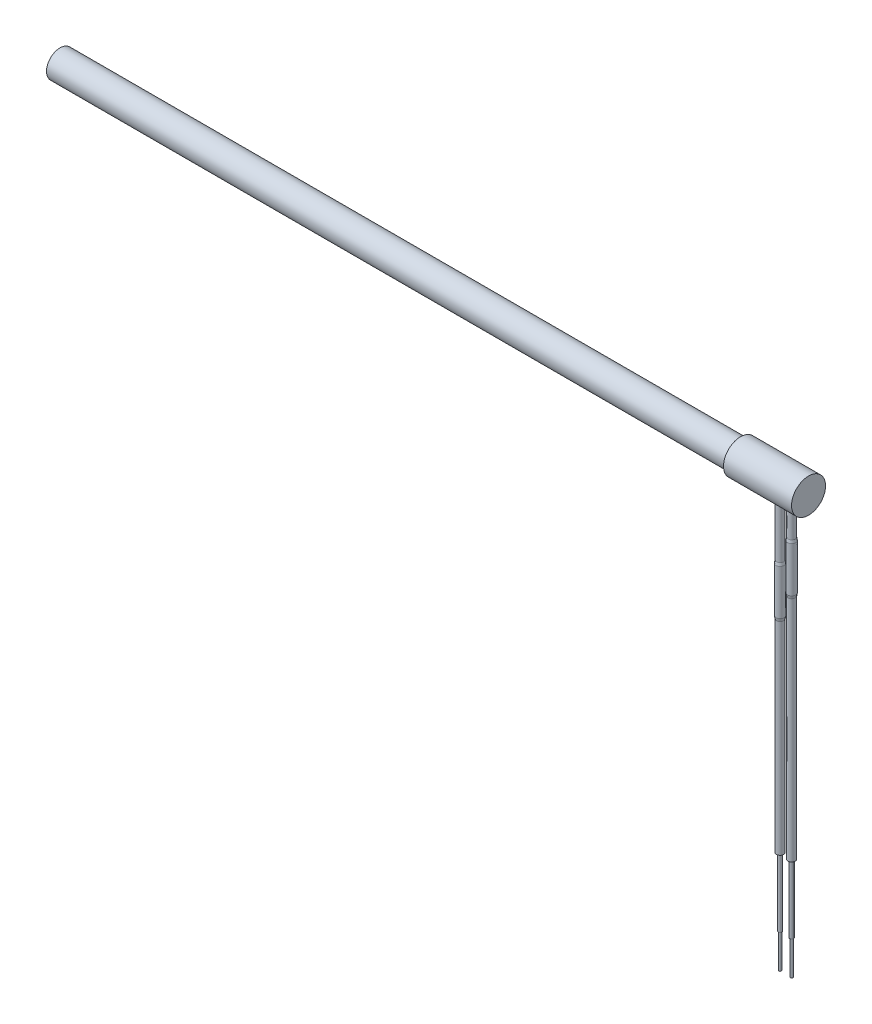
ISO-10303-21;
HEADER;
FILE_DESCRIPTION(('STEP AP214'),'2;1');
FILE_NAME('part.step','',(''),(''),'','','');
FILE_SCHEMA(('AUTOMOTIVE_DESIGN { 1 0 10303 214 1 1 1 1 }'));
ENDSEC;
DATA;
#1=APPLICATION_CONTEXT('core data for automotive mechanical design processes');
#2=APPLICATION_PROTOCOL_DEFINITION('international standard','automotive_design',2000,#1);
#3=PRODUCT_CONTEXT('',#1,'mechanical');
#4=PRODUCT('Part','Part','',(#3));
#5=PRODUCT_RELATED_PRODUCT_CATEGORY('part','',(#4));
#6=PRODUCT_DEFINITION_FORMATION('','',#4);
#7=PRODUCT_DEFINITION_CONTEXT('part definition',#1,'design');
#8=PRODUCT_DEFINITION('design','',#6,#7);
#9=PRODUCT_DEFINITION_SHAPE('','',#8);
#10=(LENGTH_UNIT() NAMED_UNIT(*) SI_UNIT(.MILLI.,.METRE.));
#11=(NAMED_UNIT(*) PLANE_ANGLE_UNIT() SI_UNIT($,.RADIAN.));
#12=(NAMED_UNIT(*) SI_UNIT($,.STERADIAN.) SOLID_ANGLE_UNIT());
#13=UNCERTAINTY_MEASURE_WITH_UNIT(LENGTH_MEASURE(1.E-05),#10,'distance_accuracy_value','');
#14=(GEOMETRIC_REPRESENTATION_CONTEXT(3) GLOBAL_UNCERTAINTY_ASSIGNED_CONTEXT((#13)) GLOBAL_UNIT_ASSIGNED_CONTEXT((#10,
#11,#12)) REPRESENTATION_CONTEXT('',''));
#15=CARTESIAN_POINT('',(0.,0.,0.));
#16=DIRECTION('',(0.,0.,1.));
#17=DIRECTION('',(1.,0.,0.));
#18=AXIS2_PLACEMENT_3D('',#15,#16,#17);
#19=CARTESIAN_POINT('',(11.63,0.,0.));
#20=DIRECTION('',(0.,1.,0.));
#21=DIRECTION('',(-1.,0.,0.));
#22=AXIS2_PLACEMENT_3D('',#19,#20,#21);
#23=CYLINDRICAL_SURFACE('',#22,1.04999999999999);
#24=CARTESIAN_POINT('',(10.58,-5.,0.));
#25=CARTESIAN_POINT('',(10.5800020670795,-4.99999892087415,-0.0582929242366816));
#26=CARTESIAN_POINT('',(10.5848707746513,-4.99897017169846,-0.116611365509766));
#27=CARTESIAN_POINT('',(10.6041990173519,-4.99496558613183,-0.231595584257538));
#28=CARTESIAN_POINT('',(10.6186657708545,-4.99198828432158,-0.288260084347116));
#29=CARTESIAN_POINT('',(10.6567200745913,-4.98441855072821,-0.398257695431897));
#30=CARTESIAN_POINT('',(10.6802984725063,-4.97982774007421,-0.451594087150224));
#31=CARTESIAN_POINT('',(10.7358785820746,-4.9695281714379,-0.55355114905671));
#32=CARTESIAN_POINT('',(10.7678799416125,-4.96381946019114,-0.602172016257577));
#33=CARTESIAN_POINT('',(10.8399011419673,-4.95181603197298,-0.694042951461569));
#34=CARTESIAN_POINT('',(10.8800220614325,-4.9455145252722,-0.737212900277572));
#35=CARTESIAN_POINT('',(10.966926357596,-4.93308430111515,-0.816262310202849));
#36=CARTESIAN_POINT('',(11.0137102916704,-4.92695559816573,-0.852141160785572));
#37=CARTESIAN_POINT('',(11.1131973295141,-4.91549827175981,-0.915937457501263));
#38=CARTESIAN_POINT('',(11.1659555086942,-4.91017836622676,-0.943770721272668));
#39=CARTESIAN_POINT('',(11.2755301548892,-4.90103795609041,-0.990146102507804));
#40=CARTESIAN_POINT('',(11.3323461764008,-4.89721728718678,-1.00868923813217));
#41=CARTESIAN_POINT('',(11.4475579304258,-4.89157688337261,-1.03569542997195));
#42=CARTESIAN_POINT('',(11.5059191533494,-4.88972913880302,-1.04429973598508));
#43=CARTESIAN_POINT('',(11.6232837965519,-4.88815958427772,-1.05162300397033));
#44=CARTESIAN_POINT('',(11.682287143505,-4.88843753407558,-1.05034308305974));
#45=CARTESIAN_POINT('',(11.7982190613358,-4.89106256175169,-1.03804815221597));
#46=CARTESIAN_POINT('',(11.855165826753,-4.89337498308973,-1.02719619088077));
#47=CARTESIAN_POINT('',(11.9664120546769,-4.89975371630494,-0.996323090753509));
#48=CARTESIAN_POINT('',(12.0207113789727,-4.90382011964053,-0.976301473821866));
#49=CARTESIAN_POINT('',(12.1255852132004,-4.9132833965949,-0.927504854980533));
#50=CARTESIAN_POINT('',(12.1761292215821,-4.91868988305608,-0.898666240724573));
#51=CARTESIAN_POINT('',(12.2717213485943,-4.93021812634629,-0.833099050287858));
#52=CARTESIAN_POINT('',(12.3167687727047,-4.93633997337369,-0.79636947866174));
#53=CARTESIAN_POINT('',(12.4010287413324,-4.9487585484276,-0.715195179306912));
#54=CARTESIAN_POINT('',(12.4401074445863,-4.9550563332825,-0.670611557142132));
#55=CARTESIAN_POINT('',(12.5102539351439,-4.96700603272251,-0.575453612067667));
#56=CARTESIAN_POINT('',(12.5413215984944,-4.97265793731329,-0.524879196481365));
#57=CARTESIAN_POINT('',(12.5945931993866,-4.98269521140964,-0.419018933981049));
#58=CARTESIAN_POINT('',(12.6167806671355,-4.98707822341839,-0.363724561359618));
#59=CARTESIAN_POINT('',(12.6515130492623,-4.99406618254208,-0.250080252056758));
#60=CARTESIAN_POINT('',(12.6640592539025,-4.99667136757323,-0.191730725354512));
#61=CARTESIAN_POINT('',(12.6789607717464,-4.9997766226025,-0.0747814806285929));
#62=CARTESIAN_POINT('',(12.6814990709266,-5.00031448713233,-0.0162060522941164));
#63=CARTESIAN_POINT('',(12.6768071881703,-4.99932996439548,0.100531867341578));
#64=CARTESIAN_POINT('',(12.669577614451,-4.99780770540671,0.158694384126916));
#65=CARTESIAN_POINT('',(12.645707092173,-4.99289773376416,0.272356774731822));
#66=CARTESIAN_POINT('',(12.6291611274063,-4.9895288570548,0.327877481794109));
#67=CARTESIAN_POINT('',(12.5872321505231,-4.98130233491784,0.435355996370231));
#68=CARTESIAN_POINT('',(12.5618484273929,-4.97644456971024,0.487313516816585));
#69=CARTESIAN_POINT('',(12.5025762854505,-4.96568540679325,0.586954628019338));
#70=CARTESIAN_POINT('',(12.4685790946396,-4.95977097058188,0.634572076596084));
#71=CARTESIAN_POINT('',(12.3931894442566,-4.94758298765372,0.723491820275085));
#72=CARTESIAN_POINT('',(12.3517961044215,-4.94130939825228,0.764793362593848));
#73=CARTESIAN_POINT('',(12.2619525545589,-4.9289811250728,0.840624189826648));
#74=CARTESIAN_POINT('',(12.2133949340224,-4.92293193044843,0.875027268233329));
#75=CARTESIAN_POINT('',(12.1110830724301,-4.9118590398142,0.935190004312758));
#76=CARTESIAN_POINT('',(12.0573290493812,-4.90683530081044,0.960950024389014));
#77=CARTESIAN_POINT('',(11.946431644652,-4.89842756340699,1.00292882698657));
#78=CARTESIAN_POINT('',(11.8893086075525,-4.89503466774294,1.01919948621189));
#79=CARTESIAN_POINT('',(11.7730596491353,-4.89025532411004,1.04189240556227));
#80=CARTESIAN_POINT('',(11.7139340208586,-4.8888685838656,1.04831610029383));
#81=CARTESIAN_POINT('',(11.5966281054558,-4.888275946434,1.05107544496625));
#82=CARTESIAN_POINT('',(11.5384526451606,-4.88902686253059,1.04761086244723));
#83=CARTESIAN_POINT('',(11.4235339467898,-4.89252781964505,1.03113587744833));
#84=CARTESIAN_POINT('',(11.3667906944967,-4.89527784080961,1.01812556976792));
#85=CARTESIAN_POINT('',(11.2564907935825,-4.90244691845735,0.983021491745304));
#86=CARTESIAN_POINT('',(11.2029252418772,-4.90686102947481,0.96095461931394));
#87=CARTESIAN_POINT('',(11.1002262627923,-4.91686326664018,0.908387766965586));
#88=CARTESIAN_POINT('',(11.0510932554725,-4.92245150389005,0.877886988901925));
#89=CARTESIAN_POINT('',(10.9576645094142,-4.93430284377158,0.80864614889629));
#90=CARTESIAN_POINT('',(10.9134762916322,-4.94057660404644,0.769762802920951));
#91=CARTESIAN_POINT('',(10.832186156234,-4.95301820370576,0.68515361335144));
#92=CARTESIAN_POINT('',(10.7950858731601,-4.95918601836046,0.639426195777574));
#93=CARTESIAN_POINT('',(10.7286097957516,-4.97080655544605,0.541779863622067));
#94=CARTESIAN_POINT('',(10.699329929035,-4.9762500197256,0.489794486766682));
#95=CARTESIAN_POINT('',(10.6499691531916,-4.98571655366597,0.381538980665321));
#96=CARTESIAN_POINT('',(10.6298802525838,-4.98974085657711,0.325272623547495));
#97=CARTESIAN_POINT('',(10.6032006947065,-4.99516703145466,0.224096334074653));
#98=CARTESIAN_POINT('',(10.5945165085657,-4.99696846689598,0.179747916168573));
#99=CARTESIAN_POINT('',(10.5829154705436,-4.99938534645405,0.090271413466689));
#100=CARTESIAN_POINT('',(10.5799983992069,-5.00000083569946,0.0451433584042562));
#101=CARTESIAN_POINT('',(10.58,-5.,0.));
#102=B_SPLINE_CURVE_WITH_KNOTS('',3,(#24,#25,#26,#27,#28,#29,#30,#31,#32,#33,#34,#35,#36,#37,
#38,#39,#40,#41,#42,#43,#44,#45,#46,#47,#48,#49,#50,#51,#52,#53,#54,#55,#56,#57,#58,#59,#60,#61,
#62,#63,#64,#65,#66,#67,#68,#69,#70,#71,#72,#73,#74,#75,#76,#77,#78,#79,#80,#81,#82,#83,#84,#85,
#86,#87,#88,#89,#90,#91,#92,#93,#94,#95,#96,#97,#98,#99,#100,#101),.UNSPECIFIED.,.T.,.F.,(4,2,2,
2,2,2,2,2,2,2,2,2,2,2,2,2,2,2,2,2,2,2,2,2,2,2,2,2,2,2,2,2,2,2,2,2,2,2,4),(0.,0.174713575706853,
0.349558696902305,0.524228647051032,0.698891296413358,0.875879239345655,1.05288199641851,
1.23167476707105,1.41044793846712,1.58664786689212,1.7628278814574,1.93606360589123,
2.10930836450164,2.28383377579593,2.45838121643621,2.63639958638669,2.81442071061263,
2.99277049128033,3.17109639975501,3.34614622112597,3.52118514315409,3.69447098177815,
3.86777076478322,4.04337874800436,4.21900764539431,4.39760379438029,4.57619245389212,
4.75379541993566,4.93137250850283,5.10538764852304,5.27940106040603,5.45290135168342,
5.62641806786611,5.80317649729146,5.97997563974627,6.15885305066519,6.33757463194375,
6.47288192379528,6.60818406671403),.UNSPECIFIED.);
#103=CARTESIAN_POINT('',(10.58,-5.,0.));
#104=VERTEX_POINT('',#103);
#105=EDGE_CURVE('E53',#104,#104,#102,.T.);
#106=ORIENTED_EDGE('',*,*,#105,.T.);
#107=EDGE_LOOP('',(#106));
#108=FACE_BOUND('',#107,.T.);
#109=CARTESIAN_POINT('',(11.63,-20.5,0.));
#110=DIRECTION('',(0.,-1.,0.));
#111=DIRECTION('',(1.,0.,0.));
#112=AXIS2_PLACEMENT_3D('',#109,#110,#111);
#113=CIRCLE('',#112,1.04999999999999);
#114=CARTESIAN_POINT('',(12.68,-20.5,0.));
#115=VERTEX_POINT('',#114);
#116=EDGE_CURVE('E40',#115,#115,#113,.T.);
#117=ORIENTED_EDGE('',*,*,#116,.F.);
#118=EDGE_LOOP('',(#117));
#119=FACE_BOUND('',#118,.T.);
#120=ADVANCED_FACE('F33',(#108,#119),#23,.T.);
#121=CARTESIAN_POINT('',(15.03,0.,0.));
#122=DIRECTION('',(0.,1.,0.));
#123=DIRECTION('',(-1.,0.,0.));
#124=AXIS2_PLACEMENT_3D('',#121,#122,#123);
#125=CYLINDRICAL_SURFACE('',#124,1.04999999999999);
#126=CARTESIAN_POINT('',(13.98,-5.,0.));
#127=CARTESIAN_POINT('',(13.9800020670795,-4.99999892087415,-0.0582929242366816));
#128=CARTESIAN_POINT('',(13.9848707746513,-4.99897017169846,-0.116611365509766));
#129=CARTESIAN_POINT('',(14.0041990173519,-4.99496558613183,-0.231595584257538));
#130=CARTESIAN_POINT('',(14.0186657708545,-4.99198828432158,-0.288260084347116));
#131=CARTESIAN_POINT('',(14.0567200745913,-4.98441855072821,-0.398257695431897));
#132=CARTESIAN_POINT('',(14.0802984725063,-4.97982774007421,-0.451594087150224));
#133=CARTESIAN_POINT('',(14.1358785820746,-4.9695281714379,-0.55355114905671));
#134=CARTESIAN_POINT('',(14.1678799416125,-4.96381946019114,-0.602172016257577));
#135=CARTESIAN_POINT('',(14.2399011419673,-4.95181603197298,-0.69404295146157));
#136=CARTESIAN_POINT('',(14.2800220614325,-4.9455145252722,-0.737212900277572));
#137=CARTESIAN_POINT('',(14.366926357596,-4.93308430111515,-0.81626231020285));
#138=CARTESIAN_POINT('',(14.4137102916704,-4.92695559816573,-0.852141160785572));
#139=CARTESIAN_POINT('',(14.5131973295141,-4.91549827175981,-0.915937457501263));
#140=CARTESIAN_POINT('',(14.5659555086942,-4.91017836622676,-0.943770721272668));
#141=CARTESIAN_POINT('',(14.6755301548892,-4.90103795609041,-0.990146102507804));
#142=CARTESIAN_POINT('',(14.7323461764008,-4.89721728718678,-1.00868923813217));
#143=CARTESIAN_POINT('',(14.8475579304258,-4.89157688337261,-1.03569542997195));
#144=CARTESIAN_POINT('',(14.9059191533494,-4.88972913880302,-1.04429973598508));
#145=CARTESIAN_POINT('',(15.0232837965519,-4.88815958427772,-1.05162300397033));
#146=CARTESIAN_POINT('',(15.082287143505,-4.88843753407558,-1.05034308305974));
#147=CARTESIAN_POINT('',(15.1982190613358,-4.89106256175169,-1.03804815221597));
#148=CARTESIAN_POINT('',(15.255165826753,-4.89337498308973,-1.02719619088077));
#149=CARTESIAN_POINT('',(15.3664120546769,-4.89975371630494,-0.996323090753509));
#150=CARTESIAN_POINT('',(15.4207113789727,-4.90382011964053,-0.976301473821865));
#151=CARTESIAN_POINT('',(15.5255852132004,-4.9132833965949,-0.927504854980534));
#152=CARTESIAN_POINT('',(15.5761292215821,-4.91868988305608,-0.898666240724575));
#153=CARTESIAN_POINT('',(15.6717213485943,-4.93021812634629,-0.833099050287861));
#154=CARTESIAN_POINT('',(15.7167687727047,-4.93633997337369,-0.796369478661742));
#155=CARTESIAN_POINT('',(15.8010287413324,-4.9487585484276,-0.715195179306913));
#156=CARTESIAN_POINT('',(15.8401074445863,-4.9550563332825,-0.670611557142134));
#157=CARTESIAN_POINT('',(15.9102539351439,-4.96700603272251,-0.575453612067668));
#158=CARTESIAN_POINT('',(15.9413215984944,-4.97265793731329,-0.524879196481365));
#159=CARTESIAN_POINT('',(15.9945931993866,-4.98269521140964,-0.419018933981046));
#160=CARTESIAN_POINT('',(16.0167806671355,-4.98707822341839,-0.363724561359616));
#161=CARTESIAN_POINT('',(16.0515130492623,-4.99406618254209,-0.250080252056757));
#162=CARTESIAN_POINT('',(16.0640592539025,-4.99667136757323,-0.19173072535451));
#163=CARTESIAN_POINT('',(16.0789607717464,-4.9997766226025,-0.0747814806285909));
#164=CARTESIAN_POINT('',(16.0814990709266,-5.00031448713233,-0.0162060522941147));
#165=CARTESIAN_POINT('',(16.0768071881703,-4.99932996439548,0.100531867341579));
#166=CARTESIAN_POINT('',(16.069577614451,-4.99780770540671,0.158694384126917));
#167=CARTESIAN_POINT('',(16.045707092173,-4.99289773376416,0.272356774731822));
#168=CARTESIAN_POINT('',(16.0291611274063,-4.9895288570548,0.327877481794109));
#169=CARTESIAN_POINT('',(15.9872321505231,-4.98130233491784,0.435355996370231));
#170=CARTESIAN_POINT('',(15.9618484273929,-4.97644456971024,0.487313516816585));
#171=CARTESIAN_POINT('',(15.9025762854505,-4.96568540679325,0.586954628019338));
#172=CARTESIAN_POINT('',(15.8685790946396,-4.95977097058188,0.634572076596084));
#173=CARTESIAN_POINT('',(15.7931894442566,-4.94758298765372,0.723491820275085));
#174=CARTESIAN_POINT('',(15.7517961044215,-4.94130939825228,0.764793362593848));
#175=CARTESIAN_POINT('',(15.6619525545589,-4.9289811250728,0.840624189826648));
#176=CARTESIAN_POINT('',(15.6133949340224,-4.92293193044843,0.875027268233329));
#177=CARTESIAN_POINT('',(15.5110830724301,-4.9118590398142,0.935190004312757));
#178=CARTESIAN_POINT('',(15.4573290493812,-4.90683530081044,0.960950024389014));
#179=CARTESIAN_POINT('',(15.346431644652,-4.89842756340699,1.00292882698657));
#180=CARTESIAN_POINT('',(15.2893086075525,-4.89503466774294,1.01919948621189));
#181=CARTESIAN_POINT('',(15.1730596491353,-4.89025532411004,1.04189240556227));
#182=CARTESIAN_POINT('',(15.1139340208586,-4.8888685838656,1.04831610029383));
#183=CARTESIAN_POINT('',(14.9966281054558,-4.888275946434,1.05107544496625));
#184=CARTESIAN_POINT('',(14.9384526451606,-4.88902686253059,1.04761086244723));
#185=CARTESIAN_POINT('',(14.8235339467898,-4.89252781964505,1.03113587744833));
#186=CARTESIAN_POINT('',(14.7667906944967,-4.89527784080961,1.01812556976792));
#187=CARTESIAN_POINT('',(14.6564907935825,-4.90244691845735,0.983021491745304));
#188=CARTESIAN_POINT('',(14.6029252418772,-4.90686102947481,0.96095461931394));
#189=CARTESIAN_POINT('',(14.5002262627923,-4.91686326664018,0.908387766965586));
#190=CARTESIAN_POINT('',(14.4510932554725,-4.92245150389005,0.877886988901925));
#191=CARTESIAN_POINT('',(14.3576645094142,-4.93430284377158,0.80864614889629));
#192=CARTESIAN_POINT('',(14.3134762916322,-4.94057660404644,0.769762802920951));
#193=CARTESIAN_POINT('',(14.232186156234,-4.95301820370576,0.68515361335144));
#194=CARTESIAN_POINT('',(14.1950858731601,-4.95918601836046,0.639426195777574));
#195=CARTESIAN_POINT('',(14.1286097957516,-4.97080655544605,0.541779863622067));
#196=CARTESIAN_POINT('',(14.099329929035,-4.9762500197256,0.489794486766682));
#197=CARTESIAN_POINT('',(14.0499691531916,-4.98571655366597,0.381538980665322));
#198=CARTESIAN_POINT('',(14.0298802525838,-4.98974085657711,0.325272623547495));
#199=CARTESIAN_POINT('',(14.0032006947065,-4.99516703145466,0.224096334074653));
#200=CARTESIAN_POINT('',(13.9945165085657,-4.99696846689598,0.179747916168573));
#201=CARTESIAN_POINT('',(13.9829154705436,-4.99938534645405,0.0902714134666891));
#202=CARTESIAN_POINT('',(13.9799983992069,-5.00000083569946,0.0451433584042562));
#203=CARTESIAN_POINT('',(13.98,-5.,0.));
#204=B_SPLINE_CURVE_WITH_KNOTS('',3,(#126,#127,#128,#129,#130,#131,#132,#133,#134,#135,#136,
#137,#138,#139,#140,#141,#142,#143,#144,#145,#146,#147,#148,#149,#150,#151,#152,#153,#154,#155,
#156,#157,#158,#159,#160,#161,#162,#163,#164,#165,#166,#167,#168,#169,#170,#171,#172,#173,#174,
#175,#176,#177,#178,#179,#180,#181,#182,#183,#184,#185,#186,#187,#188,#189,#190,#191,#192,#193,
#194,#195,#196,#197,#198,#199,#200,#201,#202,#203),.UNSPECIFIED.,.T.,.F.,(4,2,2,2,2,2,2,2,2,2,2,
2,2,2,2,2,2,2,2,2,2,2,2,2,2,2,2,2,2,2,2,2,2,2,2,2,2,2,4),(0.,0.174713575706853,
0.349558696902305,0.524228647051032,0.698891296413358,0.875879239345656,1.05288199641851,
1.23167476707105,1.41044793846712,1.58664786689212,1.7628278814574,1.93606360589124,
2.10930836450164,2.28383377579593,2.45838121643621,2.63639958638669,2.81442071061263,
2.99277049128033,3.17109639975501,3.34614622112597,3.52118514315409,3.69447098177815,
3.86777076478322,4.04337874800436,4.2190076453943,4.39760379438029,4.57619245389212,
4.75379541993566,4.93137250850282,5.10538764852304,5.27940106040603,5.45290135168342,
5.6264180678661,5.80317649729146,5.97997563974627,6.15885305066519,6.33757463194375,
6.47288192379527,6.60818406671403),.UNSPECIFIED.);
#205=CARTESIAN_POINT('',(13.98,-5.,0.));
#206=VERTEX_POINT('',#205);
#207=EDGE_CURVE('E59',#206,#206,#204,.T.);
#208=ORIENTED_EDGE('',*,*,#207,.T.);
#209=EDGE_LOOP('',(#208));
#210=FACE_BOUND('',#209,.T.);
#211=CARTESIAN_POINT('',(15.03,-13.,0.));
#212=DIRECTION('',(0.,-1.,0.));
#213=DIRECTION('',(1.,0.,0.));
#214=AXIS2_PLACEMENT_3D('',#211,#212,#213);
#215=CIRCLE('',#214,1.04999999999999);
#216=CARTESIAN_POINT('',(16.08,-13.,0.));
#217=VERTEX_POINT('',#216);
#218=EDGE_CURVE('E48',#217,#217,#215,.T.);
#219=ORIENTED_EDGE('',*,*,#218,.F.);
#220=EDGE_LOOP('',(#219));
#221=FACE_BOUND('',#220,.T.);
#222=ADVANCED_FACE('F102',(#210,#221),#125,.T.);
#223=CARTESIAN_POINT('',(-200.,0.,0.));
#224=DIRECTION('',(-1.,0.,0.));
#225=DIRECTION('',(0.,0.,1.));
#226=AXIS2_PLACEMENT_3D('',#223,#224,#225);
#227=CYLINDRICAL_SURFACE('',#226,5.);
#228=CARTESIAN_POINT('',(0.,0.,0.));
#229=DIRECTION('',(-1.,0.,0.));
#230=DIRECTION('',(0.,0.,1.));
#231=AXIS2_PLACEMENT_3D('',#228,#229,#230);
#232=CIRCLE('',#231,5.);
#233=CARTESIAN_POINT('',(0.,0.,5.));
#234=VERTEX_POINT('',#233);
#235=EDGE_CURVE('E155',#234,#234,#232,.T.);
#236=ORIENTED_EDGE('',*,*,#235,.F.);
#237=EDGE_LOOP('',(#236));
#238=FACE_BOUND('',#237,.T.);
#239=CARTESIAN_POINT('',(20.,0.,0.));
#240=DIRECTION('',(-1.,0.,0.));
#241=DIRECTION('',(0.,0.,1.));
#242=AXIS2_PLACEMENT_3D('',#239,#240,#241);
#243=CIRCLE('',#242,5.);
#244=CARTESIAN_POINT('',(20.,0.,5.));
#245=VERTEX_POINT('',#244);
#246=EDGE_CURVE('E159',#245,#245,#243,.T.);
#247=ORIENTED_EDGE('',*,*,#246,.T.);
#248=EDGE_LOOP('',(#247));
#249=FACE_BOUND('',#248,.T.);
#250=ORIENTED_EDGE('',*,*,#207,.F.);
#251=EDGE_LOOP('',(#250));
#252=FACE_BOUND('',#251,.T.);
#253=ORIENTED_EDGE('',*,*,#105,.F.);
#254=EDGE_LOOP('',(#253));
#255=FACE_BOUND('',#254,.T.);
#256=ADVANCED_FACE('F64',(#238,#249,#252,#255),#227,.T.);
#257=CARTESIAN_POINT('',(20.,0.,0.));
#258=DIRECTION('',(-1.,0.,0.));
#259=DIRECTION('',(0.,0.,1.));
#260=AXIS2_PLACEMENT_3D('',#257,#258,#259);
#261=PLANE('',#260);
#262=ORIENTED_EDGE('',*,*,#246,.F.);
#263=EDGE_LOOP('',(#262));
#264=FACE_BOUND('',#263,.T.);
#265=ADVANCED_FACE('F35',(#264),#261,.F.);
#266=CARTESIAN_POINT('',(0.,4.,0.));
#267=DIRECTION('',(1.,0.,0.));
#268=DIRECTION('',(0.,0.,-1.));
#269=AXIS2_PLACEMENT_3D('',#266,#267,#268);
#270=PLANE('',#269);
#271=CARTESIAN_POINT('',(0.,0.,0.));
#272=DIRECTION('',(-1.,0.,0.));
#273=DIRECTION('',(0.,0.,1.));
#274=AXIS2_PLACEMENT_3D('',#271,#272,#273);
#275=CIRCLE('',#274,4.);
#276=CARTESIAN_POINT('',(0.,0.,4.));
#277=VERTEX_POINT('',#276);
#278=EDGE_CURVE('E162',#277,#277,#275,.T.);
#279=ORIENTED_EDGE('',*,*,#278,.F.);
#280=EDGE_LOOP('',(#279));
#281=FACE_BOUND('',#280,.T.);
#282=ORIENTED_EDGE('',*,*,#235,.T.);
#283=EDGE_LOOP('',(#282));
#284=FACE_BOUND('',#283,.T.);
#285=ADVANCED_FACE('F129',(#281,#284),#270,.F.);
#286=CARTESIAN_POINT('',(-200.,0.,0.));
#287=DIRECTION('',(-1.,0.,0.));
#288=DIRECTION('',(0.,0.,1.));
#289=AXIS2_PLACEMENT_3D('',#286,#287,#288);
#290=CYLINDRICAL_SURFACE('',#289,3.99999999999999);
#291=CARTESIAN_POINT('',(-200.,0.,0.));
#292=DIRECTION('',(-1.,0.,0.));
#293=DIRECTION('',(0.,0.,1.));
#294=AXIS2_PLACEMENT_3D('',#291,#292,#293);
#295=CIRCLE('',#294,3.99999999999998);
#296=CARTESIAN_POINT('',(-200.,0.,3.99999999999998));
#297=VERTEX_POINT('',#296);
#298=EDGE_CURVE('E167',#297,#297,#295,.T.);
#299=ORIENTED_EDGE('',*,*,#298,.F.);
#300=EDGE_LOOP('',(#299));
#301=FACE_BOUND('',#300,.T.);
#302=ORIENTED_EDGE('',*,*,#278,.T.);
#303=EDGE_LOOP('',(#302));
#304=FACE_BOUND('',#303,.T.);
#305=ADVANCED_FACE('F126',(#301,#304),#290,.T.);
#306=CARTESIAN_POINT('',(-200.,0.,0.));
#307=DIRECTION('',(1.,0.,0.));
#308=DIRECTION('',(0.,0.,-1.));
#309=AXIS2_PLACEMENT_3D('',#306,#307,#308);
#310=PLANE('',#309);
#311=ORIENTED_EDGE('',*,*,#298,.T.);
#312=EDGE_LOOP('',(#311));
#313=FACE_BOUND('',#312,.T.);
#314=ADVANCED_FACE('F123',(#313),#310,.F.);
#315=CARTESIAN_POINT('',(15.03,-13.8506922729426,0.));
#316=DIRECTION('',(0.,-1.,0.));
#317=DIRECTION('',(1.,0.,0.));
#318=AXIS2_PLACEMENT_3D('',#315,#316,#317);
#319=CONICAL_SURFACE('',#318,1.2,0.174532925199434);
#320=ORIENTED_EDGE('',*,*,#218,.T.);
#321=EDGE_LOOP('',(#320));
#322=FACE_BOUND('',#321,.T.);
#323=CARTESIAN_POINT('',(15.03,-13.8506922729426,0.));
#324=DIRECTION('',(0.,1.,0.));
#325=DIRECTION('',(-1.,0.,0.));
#326=AXIS2_PLACEMENT_3D('',#323,#324,#325);
#327=CIRCLE('',#326,1.2);
#328=CARTESIAN_POINT('',(13.83,-13.8506922729426,0.));
#329=VERTEX_POINT('',#328);
#330=EDGE_CURVE('E200',#329,#329,#327,.T.);
#331=ORIENTED_EDGE('',*,*,#330,.T.);
#332=EDGE_LOOP('',(#331));
#333=FACE_BOUND('',#332,.T.);
#334=ADVANCED_FACE('F74',(#322,#333),#319,.T.);
#335=CARTESIAN_POINT('',(15.03,-13.,0.));
#336=DIRECTION('',(0.,1.,0.));
#337=DIRECTION('',(-1.,0.,0.));
#338=AXIS2_PLACEMENT_3D('',#335,#336,#337);
#339=CYLINDRICAL_SURFACE('',#338,1.2);
#340=ORIENTED_EDGE('',*,*,#330,.F.);
#341=EDGE_LOOP('',(#340));
#342=FACE_BOUND('',#341,.T.);
#343=CARTESIAN_POINT('',(15.03,-27.1493077270574,0.));
#344=DIRECTION('',(0.,1.,0.));
#345=DIRECTION('',(-1.,0.,0.));
#346=AXIS2_PLACEMENT_3D('',#343,#344,#345);
#347=CIRCLE('',#346,1.2);
#348=CARTESIAN_POINT('',(13.83,-27.1493077270574,0.));
#349=VERTEX_POINT('',#348);
#350=EDGE_CURVE('E203',#349,#349,#347,.T.);
#351=ORIENTED_EDGE('',*,*,#350,.T.);
#352=EDGE_LOOP('',(#351));
#353=FACE_BOUND('',#352,.T.);
#354=ADVANCED_FACE('F226',(#342,#353),#339,.T.);
#355=CARTESIAN_POINT('',(15.03,-28.,0.));
#356=DIRECTION('',(0.,1.,0.));
#357=DIRECTION('',(-1.,0.,0.));
#358=AXIS2_PLACEMENT_3D('',#355,#356,#357);
#359=CONICAL_SURFACE('',#358,1.05,0.17453292519943);
#360=ORIENTED_EDGE('',*,*,#350,.F.);
#361=EDGE_LOOP('',(#360));
#362=FACE_BOUND('',#361,.T.);
#363=CARTESIAN_POINT('',(15.03,-28.,0.));
#364=DIRECTION('',(0.,1.,0.));
#365=DIRECTION('',(-1.,0.,0.));
#366=AXIS2_PLACEMENT_3D('',#363,#364,#365);
#367=CIRCLE('',#366,1.04999999999999);
#368=CARTESIAN_POINT('',(13.98,-28.,0.));
#369=VERTEX_POINT('',#368);
#370=EDGE_CURVE('E44',#369,#369,#367,.T.);
#371=ORIENTED_EDGE('',*,*,#370,.T.);
#372=EDGE_LOOP('',(#371));
#373=FACE_BOUND('',#372,.T.);
#374=ADVANCED_FACE('F121',(#362,#373),#359,.T.);
#375=CARTESIAN_POINT('',(15.03,-125.,0.));
#376=DIRECTION('',(0.,1.,0.));
#377=DIRECTION('',(-1.,0.,0.));
#378=AXIS2_PLACEMENT_3D('',#375,#376,#377);
#379=PLANE('',#378);
#380=CARTESIAN_POINT('',(15.03,-125.,0.));
#381=DIRECTION('',(0.,1.,0.));
#382=DIRECTION('',(-1.,0.,0.));
#383=AXIS2_PLACEMENT_3D('',#380,#381,#382);
#384=CIRCLE('',#383,0.375);
#385=CARTESIAN_POINT('',(14.655,-125.,0.));
#386=VERTEX_POINT('',#385);
#387=EDGE_CURVE('E170',#386,#386,#384,.T.);
#388=ORIENTED_EDGE('',*,*,#387,.F.);
#389=EDGE_LOOP('',(#388));
#390=FACE_BOUND('',#389,.T.);
#391=ADVANCED_FACE('F117',(#390),#379,.F.);
#392=CARTESIAN_POINT('',(15.03,0.,0.));
#393=DIRECTION('',(0.,1.,0.));
#394=DIRECTION('',(-1.,0.,0.));
#395=AXIS2_PLACEMENT_3D('',#392,#393,#394);
#396=CYLINDRICAL_SURFACE('',#395,0.375000000000001);
#397=CARTESIAN_POINT('',(15.03,-115.,0.));
#398=DIRECTION('',(0.,1.,0.));
#399=DIRECTION('',(-1.,0.,0.));
#400=AXIS2_PLACEMENT_3D('',#397,#398,#399);
#401=CIRCLE('',#400,0.375000000000001);
#402=CARTESIAN_POINT('',(14.655,-115.,0.));
#403=VERTEX_POINT('',#402);
#404=EDGE_CURVE('E173',#403,#403,#401,.T.);
#405=ORIENTED_EDGE('',*,*,#404,.F.);
#406=EDGE_LOOP('',(#405));
#407=FACE_BOUND('',#406,.T.);
#408=ORIENTED_EDGE('',*,*,#387,.T.);
#409=EDGE_LOOP('',(#408));
#410=FACE_BOUND('',#409,.T.);
#411=ADVANCED_FACE('F113',(#407,#410),#396,.T.);
#412=CARTESIAN_POINT('',(15.405,-115.,0.));
#413=DIRECTION('',(0.,1.,0.));
#414=DIRECTION('',(-1.,0.,0.));
#415=AXIS2_PLACEMENT_3D('',#412,#413,#414);
#416=PLANE('',#415);
#417=CARTESIAN_POINT('',(15.03,-115.,0.));
#418=DIRECTION('',(0.,1.,0.));
#419=DIRECTION('',(-1.,0.,0.));
#420=AXIS2_PLACEMENT_3D('',#417,#418,#419);
#421=CIRCLE('',#420,0.549999999999999);
#422=CARTESIAN_POINT('',(14.48,-115.,0.));
#423=VERTEX_POINT('',#422);
#424=EDGE_CURVE('E176',#423,#423,#421,.T.);
#425=ORIENTED_EDGE('',*,*,#424,.F.);
#426=EDGE_LOOP('',(#425));
#427=FACE_BOUND('',#426,.T.);
#428=ORIENTED_EDGE('',*,*,#404,.T.);
#429=EDGE_LOOP('',(#428));
#430=FACE_BOUND('',#429,.T.);
#431=ADVANCED_FACE('F109',(#427,#430),#416,.F.);
#432=CARTESIAN_POINT('',(15.03,0.,0.));
#433=DIRECTION('',(0.,1.,0.));
#434=DIRECTION('',(-1.,0.,0.));
#435=AXIS2_PLACEMENT_3D('',#432,#433,#434);
#436=CYLINDRICAL_SURFACE('',#435,0.550000000000001);
#437=CARTESIAN_POINT('',(15.03,-95.,0.));
#438=DIRECTION('',(0.,1.,0.));
#439=DIRECTION('',(-1.,0.,0.));
#440=AXIS2_PLACEMENT_3D('',#437,#438,#439);
#441=CIRCLE('',#440,0.550000000000002);
#442=CARTESIAN_POINT('',(14.48,-95.,0.));
#443=VERTEX_POINT('',#442);
#444=EDGE_CURVE('E179',#443,#443,#441,.T.);
#445=ORIENTED_EDGE('',*,*,#444,.F.);
#446=EDGE_LOOP('',(#445));
#447=FACE_BOUND('',#446,.T.);
#448=ORIENTED_EDGE('',*,*,#424,.T.);
#449=EDGE_LOOP('',(#448));
#450=FACE_BOUND('',#449,.T.);
#451=ADVANCED_FACE('F105',(#447,#450),#436,.T.);
#452=CARTESIAN_POINT('',(15.58,-95.,0.));
#453=DIRECTION('',(0.,1.,0.));
#454=DIRECTION('',(-1.,0.,0.));
#455=AXIS2_PLACEMENT_3D('',#452,#453,#454);
#456=PLANE('',#455);
#457=CARTESIAN_POINT('',(15.03,-95.,0.));
#458=DIRECTION('',(0.,1.,0.));
#459=DIRECTION('',(-1.,0.,0.));
#460=AXIS2_PLACEMENT_3D('',#457,#458,#459);
#461=CIRCLE('',#460,1.05);
#462=CARTESIAN_POINT('',(13.98,-95.,0.));
#463=VERTEX_POINT('',#462);
#464=EDGE_CURVE('E182',#463,#463,#461,.T.);
#465=ORIENTED_EDGE('',*,*,#464,.F.);
#466=EDGE_LOOP('',(#465));
#467=FACE_BOUND('',#466,.T.);
#468=ORIENTED_EDGE('',*,*,#444,.T.);
#469=EDGE_LOOP('',(#468));
#470=FACE_BOUND('',#469,.T.);
#471=ADVANCED_FACE('F100',(#467,#470),#456,.F.);
#472=ORIENTED_EDGE('',*,*,#464,.T.);
#473=EDGE_LOOP('',(#472));
#474=FACE_BOUND('',#473,.T.);
#475=ORIENTED_EDGE('',*,*,#370,.F.);
#476=EDGE_LOOP('',(#475));
#477=FACE_BOUND('',#476,.T.);
#478=ADVANCED_FACE('F95',(#474,#477),#125,.T.);
#479=CARTESIAN_POINT('',(11.63,-21.3506922729427,0.));
#480=DIRECTION('',(0.,-1.,0.));
#481=DIRECTION('',(1.,0.,0.));
#482=AXIS2_PLACEMENT_3D('',#479,#480,#481);
#483=CONICAL_SURFACE('',#482,1.2,0.174532925199434);
#484=ORIENTED_EDGE('',*,*,#116,.T.);
#485=EDGE_LOOP('',(#484));
#486=FACE_BOUND('',#485,.T.);
#487=CARTESIAN_POINT('',(11.63,-21.3506922729427,0.));
#488=DIRECTION('',(0.,1.,0.));
#489=DIRECTION('',(-1.,0.,0.));
#490=AXIS2_PLACEMENT_3D('',#487,#488,#489);
#491=CIRCLE('',#490,1.2);
#492=CARTESIAN_POINT('',(10.43,-21.3506922729427,0.));
#493=VERTEX_POINT('',#492);
#494=EDGE_CURVE('E206',#493,#493,#491,.T.);
#495=ORIENTED_EDGE('',*,*,#494,.T.);
#496=EDGE_LOOP('',(#495));
#497=FACE_BOUND('',#496,.T.);
#498=ADVANCED_FACE('F99',(#486,#497),#483,.T.);
#499=CARTESIAN_POINT('',(11.63,-20.5,0.));
#500=DIRECTION('',(0.,1.,0.));
#501=DIRECTION('',(-1.,0.,0.));
#502=AXIS2_PLACEMENT_3D('',#499,#500,#501);
#503=CYLINDRICAL_SURFACE('',#502,1.2);
#504=ORIENTED_EDGE('',*,*,#494,.F.);
#505=EDGE_LOOP('',(#504));
#506=FACE_BOUND('',#505,.T.);
#507=CARTESIAN_POINT('',(11.63,-34.6493077270573,0.));
#508=DIRECTION('',(0.,1.,0.));
#509=DIRECTION('',(-1.,0.,0.));
#510=AXIS2_PLACEMENT_3D('',#507,#508,#509);
#511=CIRCLE('',#510,1.2);
#512=CARTESIAN_POINT('',(10.43,-34.6493077270573,0.));
#513=VERTEX_POINT('',#512);
#514=EDGE_CURVE('E209',#513,#513,#511,.T.);
#515=ORIENTED_EDGE('',*,*,#514,.T.);
#516=EDGE_LOOP('',(#515));
#517=FACE_BOUND('',#516,.T.);
#518=ADVANCED_FACE('F213',(#506,#517),#503,.T.);
#519=CARTESIAN_POINT('',(11.63,-35.5,0.));
#520=DIRECTION('',(0.,1.,0.));
#521=DIRECTION('',(-1.,0.,0.));
#522=AXIS2_PLACEMENT_3D('',#519,#520,#521);
#523=CONICAL_SURFACE('',#522,1.05,0.174532925199433);
#524=ORIENTED_EDGE('',*,*,#514,.F.);
#525=EDGE_LOOP('',(#524));
#526=FACE_BOUND('',#525,.T.);
#527=CARTESIAN_POINT('',(11.63,-35.5,0.));
#528=DIRECTION('',(0.,1.,0.));
#529=DIRECTION('',(-1.,0.,0.));
#530=AXIS2_PLACEMENT_3D('',#527,#528,#529);
#531=CIRCLE('',#530,1.04999999999999);
#532=CARTESIAN_POINT('',(10.58,-35.5,0.));
#533=VERTEX_POINT('',#532);
#534=EDGE_CURVE('E10',#533,#533,#531,.T.);
#535=ORIENTED_EDGE('',*,*,#534,.T.);
#536=EDGE_LOOP('',(#535));
#537=FACE_BOUND('',#536,.T.);
#538=ADVANCED_FACE('F93',(#526,#537),#523,.T.);
#539=CARTESIAN_POINT('',(11.63,-125.,0.));
#540=DIRECTION('',(0.,1.,0.));
#541=DIRECTION('',(-1.,0.,0.));
#542=AXIS2_PLACEMENT_3D('',#539,#540,#541);
#543=PLANE('',#542);
#544=CARTESIAN_POINT('',(11.63,-125.,0.));
#545=DIRECTION('',(0.,1.,0.));
#546=DIRECTION('',(-1.,0.,0.));
#547=AXIS2_PLACEMENT_3D('',#544,#545,#546);
#548=CIRCLE('',#547,0.375);
#549=CARTESIAN_POINT('',(11.255,-125.,0.));
#550=VERTEX_POINT('',#549);
#551=EDGE_CURVE('E185',#550,#550,#548,.T.);
#552=ORIENTED_EDGE('',*,*,#551,.F.);
#553=EDGE_LOOP('',(#552));
#554=FACE_BOUND('',#553,.T.);
#555=ADVANCED_FACE('F90',(#554),#543,.F.);
#556=CARTESIAN_POINT('',(11.63,0.,0.));
#557=DIRECTION('',(0.,1.,0.));
#558=DIRECTION('',(-1.,0.,0.));
#559=AXIS2_PLACEMENT_3D('',#556,#557,#558);
#560=CYLINDRICAL_SURFACE('',#559,0.375000000000001);
#561=CARTESIAN_POINT('',(11.63,-115.,0.));
#562=DIRECTION('',(0.,1.,0.));
#563=DIRECTION('',(-1.,0.,0.));
#564=AXIS2_PLACEMENT_3D('',#561,#562,#563);
#565=CIRCLE('',#564,0.375000000000001);
#566=CARTESIAN_POINT('',(11.255,-115.,0.));
#567=VERTEX_POINT('',#566);
#568=EDGE_CURVE('E188',#567,#567,#565,.T.);
#569=ORIENTED_EDGE('',*,*,#568,.F.);
#570=EDGE_LOOP('',(#569));
#571=FACE_BOUND('',#570,.T.);
#572=ORIENTED_EDGE('',*,*,#551,.T.);
#573=EDGE_LOOP('',(#572));
#574=FACE_BOUND('',#573,.T.);
#575=ADVANCED_FACE('F86',(#571,#574),#560,.T.);
#576=CARTESIAN_POINT('',(12.005,-115.,0.));
#577=DIRECTION('',(0.,1.,0.));
#578=DIRECTION('',(-1.,0.,0.));
#579=AXIS2_PLACEMENT_3D('',#576,#577,#578);
#580=PLANE('',#579);
#581=CARTESIAN_POINT('',(11.63,-115.,0.));
#582=DIRECTION('',(0.,1.,0.));
#583=DIRECTION('',(-1.,0.,0.));
#584=AXIS2_PLACEMENT_3D('',#581,#582,#583);
#585=CIRCLE('',#584,0.549999999999999);
#586=CARTESIAN_POINT('',(11.08,-115.,0.));
#587=VERTEX_POINT('',#586);
#588=EDGE_CURVE('E191',#587,#587,#585,.T.);
#589=ORIENTED_EDGE('',*,*,#588,.F.);
#590=EDGE_LOOP('',(#589));
#591=FACE_BOUND('',#590,.T.);
#592=ORIENTED_EDGE('',*,*,#568,.T.);
#593=EDGE_LOOP('',(#592));
#594=FACE_BOUND('',#593,.T.);
#595=ADVANCED_FACE('F82',(#591,#594),#580,.F.);
#596=CARTESIAN_POINT('',(11.63,0.,0.));
#597=DIRECTION('',(0.,1.,0.));
#598=DIRECTION('',(-1.,0.,0.));
#599=AXIS2_PLACEMENT_3D('',#596,#597,#598);
#600=CYLINDRICAL_SURFACE('',#599,0.550000000000001);
#601=CARTESIAN_POINT('',(11.63,-95.,0.));
#602=DIRECTION('',(0.,1.,0.));
#603=DIRECTION('',(-1.,0.,0.));
#604=AXIS2_PLACEMENT_3D('',#601,#602,#603);
#605=CIRCLE('',#604,0.550000000000002);
#606=CARTESIAN_POINT('',(11.08,-95.,0.));
#607=VERTEX_POINT('',#606);
#608=EDGE_CURVE('E194',#607,#607,#605,.T.);
#609=ORIENTED_EDGE('',*,*,#608,.F.);
#610=EDGE_LOOP('',(#609));
#611=FACE_BOUND('',#610,.T.);
#612=ORIENTED_EDGE('',*,*,#588,.T.);
#613=EDGE_LOOP('',(#612));
#614=FACE_BOUND('',#613,.T.);
#615=ADVANCED_FACE('F78',(#611,#614),#600,.T.);
#616=CARTESIAN_POINT('',(12.18,-95.,0.));
#617=DIRECTION('',(0.,1.,0.));
#618=DIRECTION('',(-1.,0.,0.));
#619=AXIS2_PLACEMENT_3D('',#616,#617,#618);
#620=PLANE('',#619);
#621=CARTESIAN_POINT('',(11.63,-95.,0.));
#622=DIRECTION('',(0.,1.,0.));
#623=DIRECTION('',(-1.,0.,0.));
#624=AXIS2_PLACEMENT_3D('',#621,#622,#623);
#625=CIRCLE('',#624,1.05);
#626=CARTESIAN_POINT('',(10.58,-95.,0.));
#627=VERTEX_POINT('',#626);
#628=EDGE_CURVE('E197',#627,#627,#625,.T.);
#629=ORIENTED_EDGE('',*,*,#628,.F.);
#630=EDGE_LOOP('',(#629));
#631=FACE_BOUND('',#630,.T.);
#632=ORIENTED_EDGE('',*,*,#608,.T.);
#633=EDGE_LOOP('',(#632));
#634=FACE_BOUND('',#633,.T.);
#635=ADVANCED_FACE('F72',(#631,#634),#620,.F.);
#636=ORIENTED_EDGE('',*,*,#628,.T.);
#637=EDGE_LOOP('',(#636));
#638=FACE_BOUND('',#637,.T.);
#639=ORIENTED_EDGE('',*,*,#534,.F.);
#640=EDGE_LOOP('',(#639));
#641=FACE_BOUND('',#640,.T.);
#642=ADVANCED_FACE('F67',(#638,#641),#23,.T.);
#643=CLOSED_SHELL('',(#120,#222,#256,#265,#285,#305,#314,#334,#354,#374,#391,#411,#431,#451,
#471,#478,#498,#518,#538,#555,#575,#595,#615,#635,#642));
#644=MANIFOLD_SOLID_BREP('B2',#643);
#645=ADVANCED_BREP_SHAPE_REPRESENTATION('',(#18,#644),#14);
#646=SHAPE_DEFINITION_REPRESENTATION(#9,#645);
ENDSEC;
END-ISO-10303-21;
